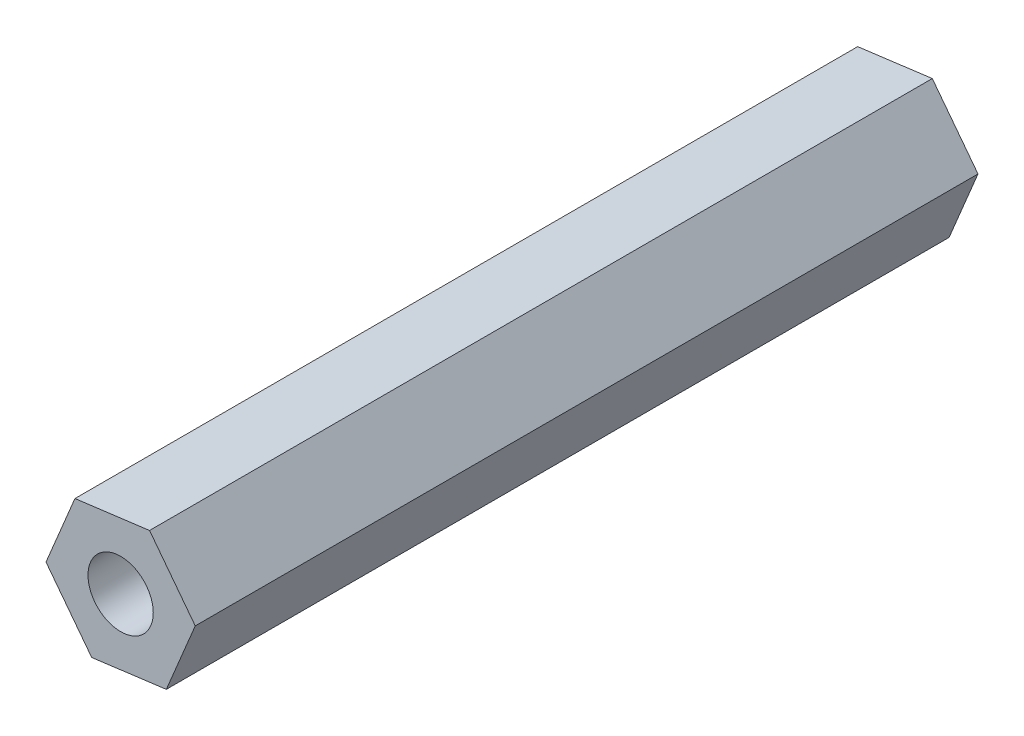
ISO-10303-21;
HEADER;
FILE_DESCRIPTION(('STEP AP214'),'2;1');
FILE_NAME('part.step','',(''),(''),'','','');
FILE_SCHEMA(('AUTOMOTIVE_DESIGN { 1 0 10303 214 1 1 1 1 }'));
ENDSEC;
DATA;
#1=APPLICATION_CONTEXT('core data for automotive mechanical design processes');
#2=APPLICATION_PROTOCOL_DEFINITION('international standard','automotive_design',2000,#1);
#3=PRODUCT_CONTEXT('',#1,'mechanical');
#4=PRODUCT('Part','Part','',(#3));
#5=PRODUCT_RELATED_PRODUCT_CATEGORY('part','',(#4));
#6=PRODUCT_DEFINITION_FORMATION('','',#4);
#7=PRODUCT_DEFINITION_CONTEXT('part definition',#1,'design');
#8=PRODUCT_DEFINITION('design','',#6,#7);
#9=PRODUCT_DEFINITION_SHAPE('','',#8);
#10=(LENGTH_UNIT() NAMED_UNIT(*) SI_UNIT(.MILLI.,.METRE.));
#11=(NAMED_UNIT(*) PLANE_ANGLE_UNIT() SI_UNIT($,.RADIAN.));
#12=(NAMED_UNIT(*) SI_UNIT($,.STERADIAN.) SOLID_ANGLE_UNIT());
#13=UNCERTAINTY_MEASURE_WITH_UNIT(LENGTH_MEASURE(1.E-05),#10,'distance_accuracy_value','');
#14=(GEOMETRIC_REPRESENTATION_CONTEXT(3) GLOBAL_UNCERTAINTY_ASSIGNED_CONTEXT((#13)) GLOBAL_UNIT_ASSIGNED_CONTEXT((#10,
#11,#12)) REPRESENTATION_CONTEXT('',''));
#15=CARTESIAN_POINT('',(0.,0.,0.));
#16=DIRECTION('',(0.,0.,1.));
#17=DIRECTION('',(1.,0.,0.));
#18=AXIS2_PLACEMENT_3D('',#15,#16,#17);
#19=CARTESIAN_POINT('',(0.,0.,76.27));
#20=DIRECTION('',(0.,0.,1.));
#21=DIRECTION('',(1.,0.,0.));
#22=AXIS2_PLACEMENT_3D('',#19,#20,#21);
#23=PLANE('',#22);
#24=DIRECTION('',(0.384520198768807,0.923116578086862,0.));
#25=VECTOR('',#24,1.);
#26=CARTESIAN_POINT('',(4.45207223514963,-5.8260094529912,76.27));
#27=LINE('',#26,#25);
#28=CARTESIAN_POINT('',(4.45207223514963,-5.8260094529912,76.27));
#29=VERTEX_POINT('',#28);
#30=CARTESIAN_POINT('',(7.27150830655346,0.942602928627349,76.27));
#31=VERTEX_POINT('',#30);
#32=EDGE_CURVE('E129',#29,#31,#27,.T.);
#33=ORIENTED_EDGE('',*,*,#32,.T.);
#34=DIRECTION('',(-0.607182307893379,0.79456254944546,0.));
#35=VECTOR('',#34,1.);
#36=CARTESIAN_POINT('',(7.27150830655346,0.942602928627349,76.27));
#37=LINE('',#36,#35);
#38=CARTESIAN_POINT('',(2.81943607140384,6.76861238161854,76.27));
#39=VERTEX_POINT('',#38);
#40=EDGE_CURVE('E87',#31,#39,#37,.T.);
#41=ORIENTED_EDGE('',*,*,#40,.T.);
#42=DIRECTION('',(-0.991702506662188,-0.1285540286414,0.));
#43=VECTOR('',#42,1.);
#44=CARTESIAN_POINT('',(2.81943607140384,6.76861238161854,76.27));
#45=LINE('',#44,#43);
#46=CARTESIAN_POINT('',(-4.45207223514962,5.8260094529912,76.27));
#47=VERTEX_POINT('',#46);
#48=EDGE_CURVE('E100',#39,#47,#45,.T.);
#49=ORIENTED_EDGE('',*,*,#48,.T.);
#50=DIRECTION('',(-0.384520198768808,-0.923116578086861,0.));
#51=VECTOR('',#50,1.);
#52=CARTESIAN_POINT('',(-4.45207223514962,5.8260094529912,76.27));
#53=LINE('',#52,#51);
#54=CARTESIAN_POINT('',(-7.27150830655346,-0.942602928627337,76.27));
#55=VERTEX_POINT('',#54);
#56=EDGE_CURVE('E94',#47,#55,#53,.T.);
#57=ORIENTED_EDGE('',*,*,#56,.T.);
#58=DIRECTION('',(0.607182307893379,-0.79456254944546,0.));
#59=VECTOR('',#58,1.);
#60=CARTESIAN_POINT('',(-7.27150830655346,-0.942602928627337,76.27));
#61=LINE('',#60,#59);
#62=CARTESIAN_POINT('',(-2.81943607140382,-6.76861238161854,76.27));
#63=VERTEX_POINT('',#62);
#64=EDGE_CURVE('E98',#55,#63,#61,.T.);
#65=ORIENTED_EDGE('',*,*,#64,.T.);
#66=DIRECTION('',(0.991702506662188,0.1285540286414,0.));
#67=VECTOR('',#66,1.);
#68=CARTESIAN_POINT('',(-2.81943607140382,-6.76861238161854,76.27));
#69=LINE('',#68,#67);
#70=EDGE_CURVE('E50',#63,#29,#69,.T.);
#71=ORIENTED_EDGE('',*,*,#70,.T.);
#72=EDGE_LOOP('',(#33,#41,#49,#57,#65,#71));
#73=FACE_BOUND('',#72,.T.);
#74=CARTESIAN_POINT('',(0.,0.,76.27));
#75=DIRECTION('',(0.,0.,1.));
#76=DIRECTION('',(1.,0.,0.));
#77=AXIS2_PLACEMENT_3D('',#74,#75,#76);
#78=CIRCLE('',#77,3.18);
#79=CARTESIAN_POINT('',(3.18,0.,76.27));
#80=VERTEX_POINT('',#79);
#81=EDGE_CURVE('E122',#80,#80,#78,.T.);
#82=ORIENTED_EDGE('',*,*,#81,.F.);
#83=EDGE_LOOP('',(#82));
#84=FACE_BOUND('',#83,.T.);
#85=ADVANCED_FACE('F33',(#73,#84),#23,.T.);
#86=CARTESIAN_POINT('',(0.,0.,0.));
#87=DIRECTION('',(0.,0.,1.));
#88=DIRECTION('',(1.,0.,0.));
#89=AXIS2_PLACEMENT_3D('',#86,#87,#88);
#90=PLANE('',#89);
#91=DIRECTION('',(0.384520198768807,0.923116578086862,0.));
#92=VECTOR('',#91,1.);
#93=CARTESIAN_POINT('',(4.45207223514963,-5.8260094529912,0.));
#94=LINE('',#93,#92);
#95=CARTESIAN_POINT('',(4.45207223514963,-5.8260094529912,0.));
#96=VERTEX_POINT('',#95);
#97=CARTESIAN_POINT('',(7.27150830655346,0.942602928627349,0.));
#98=VERTEX_POINT('',#97);
#99=EDGE_CURVE('E118',#96,#98,#94,.T.);
#100=ORIENTED_EDGE('',*,*,#99,.F.);
#101=DIRECTION('',(0.991702506662188,0.1285540286414,0.));
#102=VECTOR('',#101,1.);
#103=CARTESIAN_POINT('',(-2.81943607140382,-6.76861238161854,0.));
#104=LINE('',#103,#102);
#105=CARTESIAN_POINT('',(-2.81943607140382,-6.76861238161854,0.));
#106=VERTEX_POINT('',#105);
#107=EDGE_CURVE('E79',#106,#96,#104,.T.);
#108=ORIENTED_EDGE('',*,*,#107,.F.);
#109=DIRECTION('',(0.607182307893379,-0.79456254944546,0.));
#110=VECTOR('',#109,1.);
#111=CARTESIAN_POINT('',(-7.27150830655346,-0.942602928627337,0.));
#112=LINE('',#111,#110);
#113=CARTESIAN_POINT('',(-7.27150830655346,-0.942602928627337,0.));
#114=VERTEX_POINT('',#113);
#115=EDGE_CURVE('E73',#114,#106,#112,.T.);
#116=ORIENTED_EDGE('',*,*,#115,.F.);
#117=DIRECTION('',(-0.384520198768808,-0.923116578086861,0.));
#118=VECTOR('',#117,1.);
#119=CARTESIAN_POINT('',(-4.45207223514962,5.8260094529912,0.));
#120=LINE('',#119,#118);
#121=CARTESIAN_POINT('',(-4.45207223514962,5.8260094529912,0.));
#122=VERTEX_POINT('',#121);
#123=EDGE_CURVE('E108',#122,#114,#120,.T.);
#124=ORIENTED_EDGE('',*,*,#123,.F.);
#125=DIRECTION('',(-0.991702506662188,-0.1285540286414,0.));
#126=VECTOR('',#125,1.);
#127=CARTESIAN_POINT('',(2.81943607140384,6.76861238161854,0.));
#128=LINE('',#127,#126);
#129=CARTESIAN_POINT('',(2.81943607140384,6.76861238161854,0.));
#130=VERTEX_POINT('',#129);
#131=EDGE_CURVE('E124',#130,#122,#128,.T.);
#132=ORIENTED_EDGE('',*,*,#131,.F.);
#133=DIRECTION('',(-0.607182307893379,0.79456254944546,0.));
#134=VECTOR('',#133,1.);
#135=CARTESIAN_POINT('',(7.27150830655346,0.942602928627349,0.));
#136=LINE('',#135,#134);
#137=EDGE_CURVE('E121',#98,#130,#136,.T.);
#138=ORIENTED_EDGE('',*,*,#137,.F.);
#139=EDGE_LOOP('',(#100,#108,#116,#124,#132,#138));
#140=FACE_BOUND('',#139,.T.);
#141=CARTESIAN_POINT('',(0.,0.,0.));
#142=DIRECTION('',(0.,0.,1.));
#143=DIRECTION('',(1.,0.,0.));
#144=AXIS2_PLACEMENT_3D('',#141,#142,#143);
#145=CIRCLE('',#144,3.18);
#146=CARTESIAN_POINT('',(3.18,0.,0.));
#147=VERTEX_POINT('',#146);
#148=EDGE_CURVE('E222',#147,#147,#145,.T.);
#149=ORIENTED_EDGE('',*,*,#148,.T.);
#150=EDGE_LOOP('',(#149));
#151=FACE_BOUND('',#150,.T.);
#152=ADVANCED_FACE('F138',(#140,#151),#90,.F.);
#153=CARTESIAN_POINT('',(4.45207223514963,-5.8260094529912,76.27));
#154=DIRECTION('',(-0.923116578086862,0.384520198768807,0.));
#155=DIRECTION('',(-0.384520198768807,-0.923116578086862,0.));
#156=AXIS2_PLACEMENT_3D('',#153,#154,#155);
#157=PLANE('',#156);
#158=ORIENTED_EDGE('',*,*,#99,.T.);
#159=DIRECTION('',(0.,0.,-1.));
#160=VECTOR('',#159,1.);
#161=CARTESIAN_POINT('',(7.27150830655346,0.942602928627349,76.27));
#162=LINE('',#161,#160);
#163=EDGE_CURVE('E11',#31,#98,#162,.T.);
#164=ORIENTED_EDGE('',*,*,#163,.F.);
#165=ORIENTED_EDGE('',*,*,#32,.F.);
#166=DIRECTION('',(0.,0.,-1.));
#167=VECTOR('',#166,1.);
#168=CARTESIAN_POINT('',(4.45207223514963,-5.8260094529912,76.27));
#169=LINE('',#168,#167);
#170=EDGE_CURVE('E114',#29,#96,#169,.T.);
#171=ORIENTED_EDGE('',*,*,#170,.T.);
#172=EDGE_LOOP('',(#158,#164,#165,#171));
#173=FACE_BOUND('',#172,.T.);
#174=ADVANCED_FACE('F35',(#173),#157,.F.);
#175=CARTESIAN_POINT('',(7.27150830655346,0.942602928627349,76.27));
#176=DIRECTION('',(-0.79456254944546,-0.60718230789338,0.));
#177=DIRECTION('',(0.607182307893379,-0.79456254944546,0.));
#178=AXIS2_PLACEMENT_3D('',#175,#176,#177);
#179=PLANE('',#178);
#180=ORIENTED_EDGE('',*,*,#137,.T.);
#181=DIRECTION('',(0.,0.,-1.));
#182=VECTOR('',#181,1.);
#183=CARTESIAN_POINT('',(2.81943607140384,6.76861238161854,76.27));
#184=LINE('',#183,#182);
#185=EDGE_CURVE('E42',#39,#130,#184,.T.);
#186=ORIENTED_EDGE('',*,*,#185,.F.);
#187=ORIENTED_EDGE('',*,*,#40,.F.);
#188=ORIENTED_EDGE('',*,*,#163,.T.);
#189=EDGE_LOOP('',(#180,#186,#187,#188));
#190=FACE_BOUND('',#189,.T.);
#191=ADVANCED_FACE('F163',(#190),#179,.F.);
#192=CARTESIAN_POINT('',(2.81943607140384,6.76861238161854,76.27));
#193=DIRECTION('',(0.1285540286414,-0.991702506662187,0.));
#194=DIRECTION('',(0.991702506662188,0.1285540286414,0.));
#195=AXIS2_PLACEMENT_3D('',#192,#193,#194);
#196=PLANE('',#195);
#197=ORIENTED_EDGE('',*,*,#131,.T.);
#198=DIRECTION('',(0.,0.,-1.));
#199=VECTOR('',#198,1.);
#200=CARTESIAN_POINT('',(-4.45207223514962,5.8260094529912,76.27));
#201=LINE('',#200,#199);
#202=EDGE_CURVE('E109',#47,#122,#201,.T.);
#203=ORIENTED_EDGE('',*,*,#202,.F.);
#204=ORIENTED_EDGE('',*,*,#48,.F.);
#205=ORIENTED_EDGE('',*,*,#185,.T.);
#206=EDGE_LOOP('',(#197,#203,#204,#205));
#207=FACE_BOUND('',#206,.T.);
#208=ADVANCED_FACE('F135',(#207),#196,.F.);
#209=CARTESIAN_POINT('',(-4.45207223514962,5.8260094529912,76.27));
#210=DIRECTION('',(0.923116578086861,-0.384520198768808,0.));
#211=DIRECTION('',(0.384520198768808,0.923116578086862,0.));
#212=AXIS2_PLACEMENT_3D('',#209,#210,#211);
#213=PLANE('',#212);
#214=ORIENTED_EDGE('',*,*,#123,.T.);
#215=DIRECTION('',(0.,0.,-1.));
#216=VECTOR('',#215,1.);
#217=CARTESIAN_POINT('',(-7.27150830655346,-0.942602928627337,76.27));
#218=LINE('',#217,#216);
#219=EDGE_CURVE('E105',#55,#114,#218,.T.);
#220=ORIENTED_EDGE('',*,*,#219,.F.);
#221=ORIENTED_EDGE('',*,*,#56,.F.);
#222=ORIENTED_EDGE('',*,*,#202,.T.);
#223=EDGE_LOOP('',(#214,#220,#221,#222));
#224=FACE_BOUND('',#223,.T.);
#225=ADVANCED_FACE('F106',(#224),#213,.F.);
#226=CARTESIAN_POINT('',(-7.27150830655346,-0.942602928627337,76.27));
#227=DIRECTION('',(0.794562549445461,0.607182307893379,0.));
#228=DIRECTION('',(-0.607182307893379,0.794562549445461,0.));
#229=AXIS2_PLACEMENT_3D('',#226,#227,#228);
#230=PLANE('',#229);
#231=ORIENTED_EDGE('',*,*,#115,.T.);
#232=DIRECTION('',(0.,0.,-1.));
#233=VECTOR('',#232,1.);
#234=CARTESIAN_POINT('',(-2.81943607140382,-6.76861238161854,76.27));
#235=LINE('',#234,#233);
#236=EDGE_CURVE('E110',#63,#106,#235,.T.);
#237=ORIENTED_EDGE('',*,*,#236,.F.);
#238=ORIENTED_EDGE('',*,*,#64,.F.);
#239=ORIENTED_EDGE('',*,*,#219,.T.);
#240=EDGE_LOOP('',(#231,#237,#238,#239));
#241=FACE_BOUND('',#240,.T.);
#242=ADVANCED_FACE('F112',(#241),#230,.F.);
#243=CARTESIAN_POINT('',(-2.81943607140382,-6.76861238161854,76.27));
#244=DIRECTION('',(-0.1285540286414,0.991702506662188,0.));
#245=DIRECTION('',(-0.991702506662188,-0.1285540286414,0.));
#246=AXIS2_PLACEMENT_3D('',#243,#244,#245);
#247=PLANE('',#246);
#248=ORIENTED_EDGE('',*,*,#107,.T.);
#249=ORIENTED_EDGE('',*,*,#170,.F.);
#250=ORIENTED_EDGE('',*,*,#70,.F.);
#251=ORIENTED_EDGE('',*,*,#236,.T.);
#252=EDGE_LOOP('',(#248,#249,#250,#251));
#253=FACE_BOUND('',#252,.T.);
#254=ADVANCED_FACE('F143',(#253),#247,.F.);
#255=CARTESIAN_POINT('',(0.,0.,76.27));
#256=DIRECTION('',(0.,0.,-1.));
#257=DIRECTION('',(-1.,0.,0.));
#258=AXIS2_PLACEMENT_3D('',#255,#256,#257);
#259=CYLINDRICAL_SURFACE('',#258,3.18);
#260=ORIENTED_EDGE('',*,*,#81,.T.);
#261=EDGE_LOOP('',(#260));
#262=FACE_BOUND('',#261,.T.);
#263=ORIENTED_EDGE('',*,*,#148,.F.);
#264=EDGE_LOOP('',(#263));
#265=FACE_BOUND('',#264,.T.);
#266=ADVANCED_FACE('F145',(#262,#265),#259,.F.);
#267=CLOSED_SHELL('',(#85,#152,#174,#191,#208,#225,#242,#254,#266));
#268=MANIFOLD_SOLID_BREP('B2',#267);
#269=ADVANCED_BREP_SHAPE_REPRESENTATION('',(#18,#268),#14);
#270=SHAPE_DEFINITION_REPRESENTATION(#9,#269);
ENDSEC;
END-ISO-10303-21;
